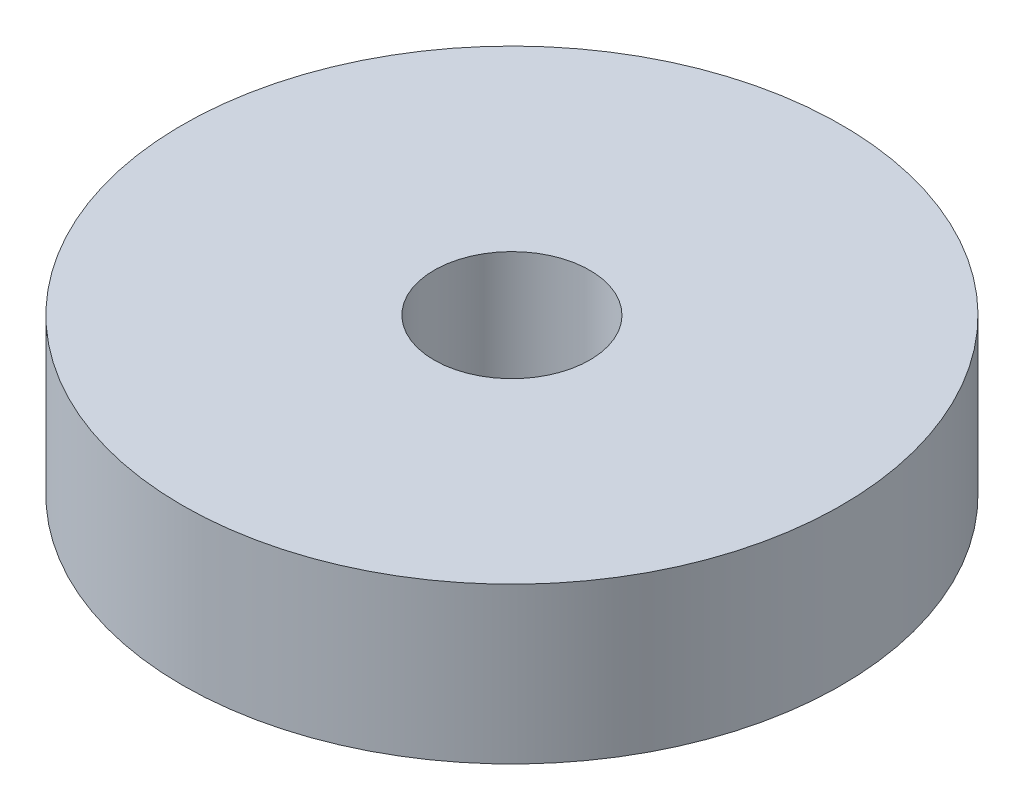
ISO-10303-21;
HEADER;
FILE_DESCRIPTION(('STEP AP214'),'2;1');
FILE_NAME('part.step','',(''),(''),'','','');
FILE_SCHEMA(('AUTOMOTIVE_DESIGN { 1 0 10303 214 1 1 1 1 }'));
ENDSEC;
DATA;
#1=APPLICATION_CONTEXT('core data for automotive mechanical design processes');
#2=APPLICATION_PROTOCOL_DEFINITION('international standard','automotive_design',2000,#1);
#3=PRODUCT_CONTEXT('',#1,'mechanical');
#4=PRODUCT('Part','Part','',(#3));
#5=PRODUCT_RELATED_PRODUCT_CATEGORY('part','',(#4));
#6=PRODUCT_DEFINITION_FORMATION('','',#4);
#7=PRODUCT_DEFINITION_CONTEXT('part definition',#1,'design');
#8=PRODUCT_DEFINITION('design','',#6,#7);
#9=PRODUCT_DEFINITION_SHAPE('','',#8);
#10=(LENGTH_UNIT() NAMED_UNIT(*) SI_UNIT(.MILLI.,.METRE.));
#11=(NAMED_UNIT(*) PLANE_ANGLE_UNIT() SI_UNIT($,.RADIAN.));
#12=(NAMED_UNIT(*) SI_UNIT($,.STERADIAN.) SOLID_ANGLE_UNIT());
#13=UNCERTAINTY_MEASURE_WITH_UNIT(LENGTH_MEASURE(1.E-05),#10,'distance_accuracy_value','');
#14=(GEOMETRIC_REPRESENTATION_CONTEXT(3) GLOBAL_UNCERTAINTY_ASSIGNED_CONTEXT((#13)) GLOBAL_UNIT_ASSIGNED_CONTEXT((#10,
#11,#12)) REPRESENTATION_CONTEXT('',''));
#15=CARTESIAN_POINT('',(0.,0.,0.));
#16=DIRECTION('',(0.,0.,1.));
#17=DIRECTION('',(1.,0.,0.));
#18=AXIS2_PLACEMENT_3D('',#15,#16,#17);
#19=CARTESIAN_POINT('',(0.,6.,0.));
#20=DIRECTION('',(0.,1.,0.));
#21=DIRECTION('',(0.,0.,1.));
#22=AXIS2_PLACEMENT_3D('',#19,#20,#21);
#23=PLANE('',#22);
#24=CARTESIAN_POINT('',(0.,6.,0.));
#25=DIRECTION('',(0.,1.,0.));
#26=DIRECTION('',(0.,0.,1.));
#27=AXIS2_PLACEMENT_3D('',#24,#25,#26);
#28=CIRCLE('',#27,12.7);
#29=CARTESIAN_POINT('',(0.,6.,12.7));
#30=VERTEX_POINT('',#29);
#31=EDGE_CURVE('E10',#30,#30,#28,.T.);
#32=ORIENTED_EDGE('',*,*,#31,.T.);
#33=EDGE_LOOP('',(#32));
#34=FACE_BOUND('',#33,.T.);
#35=CARTESIAN_POINT('',(0.,6.,0.));
#36=DIRECTION('',(0.,1.,0.));
#37=DIRECTION('',(0.,0.,1.));
#38=AXIS2_PLACEMENT_3D('',#35,#36,#37);
#39=CIRCLE('',#38,3.);
#40=CARTESIAN_POINT('',(0.,6.,3.));
#41=VERTEX_POINT('',#40);
#42=EDGE_CURVE('E56',#41,#41,#39,.T.);
#43=ORIENTED_EDGE('',*,*,#42,.F.);
#44=EDGE_LOOP('',(#43));
#45=FACE_BOUND('',#44,.T.);
#46=ADVANCED_FACE('F43',(#34,#45),#23,.T.);
#47=CARTESIAN_POINT('',(0.,0.,0.));
#48=DIRECTION('',(0.,1.,0.));
#49=DIRECTION('',(0.,0.,1.));
#50=AXIS2_PLACEMENT_3D('',#47,#48,#49);
#51=PLANE('',#50);
#52=CARTESIAN_POINT('',(0.,0.,0.));
#53=DIRECTION('',(0.,1.,0.));
#54=DIRECTION('',(0.,0.,1.));
#55=AXIS2_PLACEMENT_3D('',#52,#53,#54);
#56=CIRCLE('',#55,12.7);
#57=CARTESIAN_POINT('',(0.,0.,12.7));
#58=VERTEX_POINT('',#57);
#59=EDGE_CURVE('E47',#58,#58,#56,.T.);
#60=ORIENTED_EDGE('',*,*,#59,.F.);
#61=EDGE_LOOP('',(#60));
#62=FACE_BOUND('',#61,.T.);
#63=CARTESIAN_POINT('',(0.,0.,0.));
#64=DIRECTION('',(0.,1.,0.));
#65=DIRECTION('',(0.,0.,1.));
#66=AXIS2_PLACEMENT_3D('',#63,#64,#65);
#67=CIRCLE('',#66,3.);
#68=CARTESIAN_POINT('',(0.,0.,3.));
#69=VERTEX_POINT('',#68);
#70=EDGE_CURVE('E58',#69,#69,#67,.T.);
#71=ORIENTED_EDGE('',*,*,#70,.T.);
#72=EDGE_LOOP('',(#71));
#73=FACE_BOUND('',#72,.T.);
#74=ADVANCED_FACE('F70',(#62,#73),#51,.F.);
#75=CARTESIAN_POINT('',(0.,6.,0.));
#76=DIRECTION('',(0.,-1.,0.));
#77=DIRECTION('',(0.,0.,-1.));
#78=AXIS2_PLACEMENT_3D('',#75,#76,#77);
#79=CYLINDRICAL_SURFACE('',#78,12.7);
#80=ORIENTED_EDGE('',*,*,#31,.F.);
#81=EDGE_LOOP('',(#80));
#82=FACE_BOUND('',#81,.T.);
#83=ORIENTED_EDGE('',*,*,#59,.T.);
#84=EDGE_LOOP('',(#83));
#85=FACE_BOUND('',#84,.T.);
#86=ADVANCED_FACE('F45',(#82,#85),#79,.T.);
#87=CARTESIAN_POINT('',(0.,6.,0.));
#88=DIRECTION('',(0.,-1.,0.));
#89=DIRECTION('',(0.,0.,-1.));
#90=AXIS2_PLACEMENT_3D('',#87,#88,#89);
#91=CYLINDRICAL_SURFACE('',#90,3.);
#92=ORIENTED_EDGE('',*,*,#42,.T.);
#93=EDGE_LOOP('',(#92));
#94=FACE_BOUND('',#93,.T.);
#95=ORIENTED_EDGE('',*,*,#70,.F.);
#96=EDGE_LOOP('',(#95));
#97=FACE_BOUND('',#96,.T.);
#98=ADVANCED_FACE('F66',(#94,#97),#91,.F.);
#99=CLOSED_SHELL('',(#46,#74,#86,#98));
#100=MANIFOLD_SOLID_BREP('B2',#99);
#101=ADVANCED_BREP_SHAPE_REPRESENTATION('',(#18,#100),#14);
#102=SHAPE_DEFINITION_REPRESENTATION(#9,#101);
ENDSEC;
END-ISO-10303-21;
